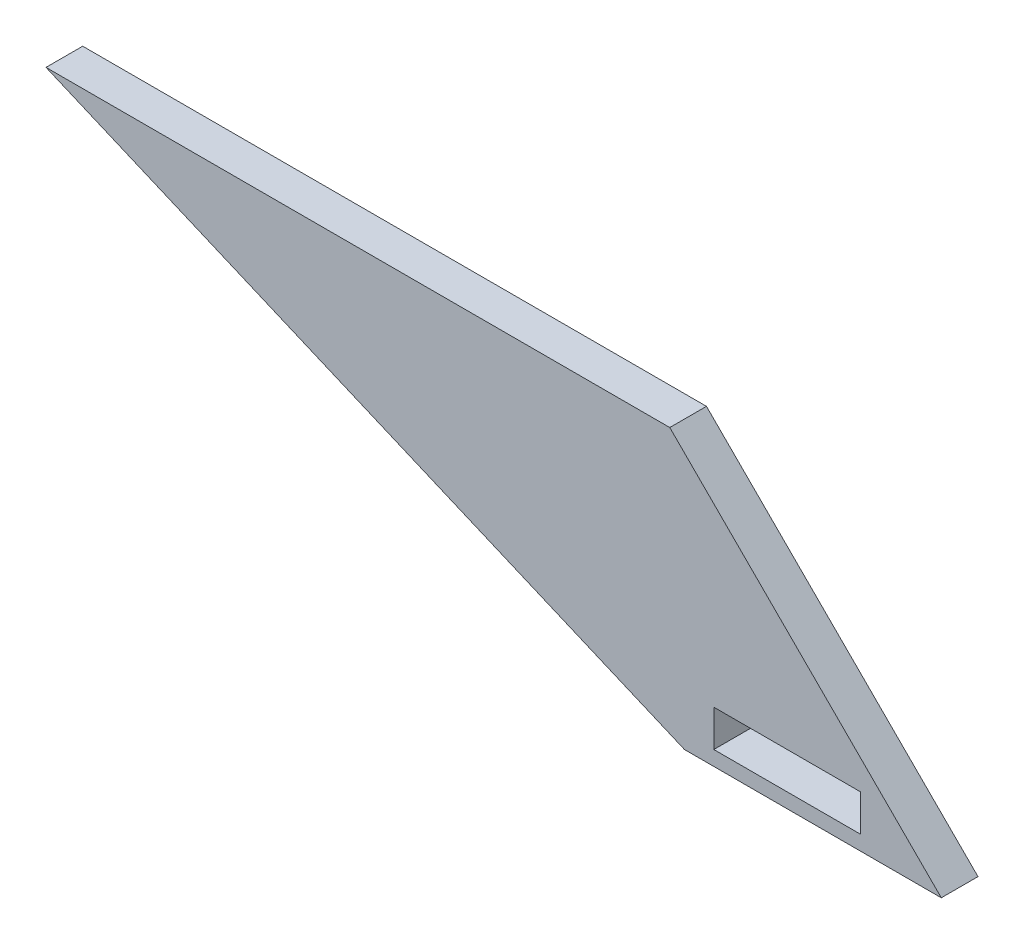
ISO-10303-21;
HEADER;
FILE_DESCRIPTION(('STEP AP214'),'2;1');
FILE_NAME('part.step','',(''),(''),'','','');
FILE_SCHEMA(('AUTOMOTIVE_DESIGN { 1 0 10303 214 1 1 1 1 }'));
ENDSEC;
DATA;
#1=APPLICATION_CONTEXT('core data for automotive mechanical design processes');
#2=APPLICATION_PROTOCOL_DEFINITION('international standard','automotive_design',2000,#1);
#3=PRODUCT_CONTEXT('',#1,'mechanical');
#4=PRODUCT('Part','Part','',(#3));
#5=PRODUCT_RELATED_PRODUCT_CATEGORY('part','',(#4));
#6=PRODUCT_DEFINITION_FORMATION('','',#4);
#7=PRODUCT_DEFINITION_CONTEXT('part definition',#1,'design');
#8=PRODUCT_DEFINITION('design','',#6,#7);
#9=PRODUCT_DEFINITION_SHAPE('','',#8);
#10=(LENGTH_UNIT() NAMED_UNIT(*) SI_UNIT(.MILLI.,.METRE.));
#11=(NAMED_UNIT(*) PLANE_ANGLE_UNIT() SI_UNIT($,.RADIAN.));
#12=(NAMED_UNIT(*) SI_UNIT($,.STERADIAN.) SOLID_ANGLE_UNIT());
#13=UNCERTAINTY_MEASURE_WITH_UNIT(LENGTH_MEASURE(1.E-05),#10,'distance_accuracy_value','');
#14=(GEOMETRIC_REPRESENTATION_CONTEXT(3) GLOBAL_UNCERTAINTY_ASSIGNED_CONTEXT((#13)) GLOBAL_UNIT_ASSIGNED_CONTEXT((#10,
#11,#12)) REPRESENTATION_CONTEXT('',''));
#15=CARTESIAN_POINT('',(0.,0.,0.));
#16=DIRECTION('',(0.,0.,1.));
#17=DIRECTION('',(1.,0.,0.));
#18=AXIS2_PLACEMENT_3D('',#15,#16,#17);
#19=CARTESIAN_POINT('',(14.9175348755076,6.59668020483856,5.));
#20=DIRECTION('',(0.391364608048821,0.920235700006685,0.));
#21=DIRECTION('',(-0.920235700006685,0.391364608048821,0.));
#22=AXIS2_PLACEMENT_3D('',#19,#20,#21);
#23=PLANE('',#22);
#24=DIRECTION('',(0.920235700006685,-0.391364608048821,0.));
#25=VECTOR('',#24,1.);
#26=CARTESIAN_POINT('',(14.9175348755076,6.59668020483856,0.));
#27=LINE('',#26,#25);
#28=CARTESIAN_POINT('',(-72.0824651244923,43.5966802048386,0.));
#29=VERTEX_POINT('',#28);
#30=CARTESIAN_POINT('',(14.9175348755076,6.59668020483856,0.));
#31=VERTEX_POINT('',#30);
#32=EDGE_CURVE('E122',#29,#31,#27,.T.);
#33=ORIENTED_EDGE('',*,*,#32,.T.);
#34=DIRECTION('',(0.,0.,-1.));
#35=VECTOR('',#34,1.);
#36=CARTESIAN_POINT('',(14.9175348755076,6.59668020483856,5.));
#37=LINE('',#36,#35);
#38=CARTESIAN_POINT('',(14.9175348755076,6.59668020483856,5.));
#39=VERTEX_POINT('',#38);
#40=EDGE_CURVE('E151',#39,#31,#37,.T.);
#41=ORIENTED_EDGE('',*,*,#40,.F.);
#42=DIRECTION('',(0.920235700006685,-0.391364608048821,0.));
#43=VECTOR('',#42,1.);
#44=CARTESIAN_POINT('',(14.9175348755076,6.59668020483856,5.));
#45=LINE('',#44,#43);
#46=CARTESIAN_POINT('',(-72.0824651244923,43.5966802048386,5.));
#47=VERTEX_POINT('',#46);
#48=EDGE_CURVE('E125',#47,#39,#45,.T.);
#49=ORIENTED_EDGE('',*,*,#48,.F.);
#50=DIRECTION('',(0.,0.,-1.));
#51=VECTOR('',#50,1.);
#52=CARTESIAN_POINT('',(-72.0824651244923,43.5966802048386,5.));
#53=LINE('',#52,#51);
#54=EDGE_CURVE('E135',#47,#29,#53,.T.);
#55=ORIENTED_EDGE('',*,*,#54,.T.);
#56=EDGE_LOOP('',(#33,#41,#49,#55));
#57=FACE_BOUND('',#56,.T.);
#58=ADVANCED_FACE('F33',(#57),#23,.F.);
#59=CARTESIAN_POINT('',(49.9175348755076,6.59668020483857,5.));
#60=DIRECTION('',(0.,1.,0.));
#61=DIRECTION('',(-1.,0.,0.));
#62=AXIS2_PLACEMENT_3D('',#59,#60,#61);
#63=PLANE('',#62);
#64=DIRECTION('',(1.,0.,0.));
#65=VECTOR('',#64,1.);
#66=CARTESIAN_POINT('',(49.9175348755076,6.59668020483857,0.));
#67=LINE('',#66,#65);
#68=CARTESIAN_POINT('',(49.9175348755076,6.59668020483857,0.));
#69=VERTEX_POINT('',#68);
#70=EDGE_CURVE('E138',#31,#69,#67,.T.);
#71=ORIENTED_EDGE('',*,*,#70,.T.);
#72=DIRECTION('',(0.,0.,-1.));
#73=VECTOR('',#72,1.);
#74=CARTESIAN_POINT('',(49.9175348755076,6.59668020483857,5.));
#75=LINE('',#74,#73);
#76=CARTESIAN_POINT('',(49.9175348755076,6.59668020483857,5.));
#77=VERTEX_POINT('',#76);
#78=EDGE_CURVE('E148',#77,#69,#75,.T.);
#79=ORIENTED_EDGE('',*,*,#78,.F.);
#80=DIRECTION('',(1.,0.,0.));
#81=VECTOR('',#80,1.);
#82=CARTESIAN_POINT('',(49.9175348755076,6.59668020483857,5.));
#83=LINE('',#82,#81);
#84=EDGE_CURVE('E128',#39,#77,#83,.T.);
#85=ORIENTED_EDGE('',*,*,#84,.F.);
#86=ORIENTED_EDGE('',*,*,#40,.T.);
#87=EDGE_LOOP('',(#71,#79,#85,#86));
#88=FACE_BOUND('',#87,.T.);
#89=ADVANCED_FACE('F176',(#88),#63,.F.);
#90=CARTESIAN_POINT('',(12.9175348755077,43.5966802048386,5.));
#91=DIRECTION('',(-0.707106781186549,-0.707106781186546,0.));
#92=DIRECTION('',(0.707106781186546,-0.707106781186549,0.));
#93=AXIS2_PLACEMENT_3D('',#90,#91,#92);
#94=PLANE('',#93);
#95=DIRECTION('',(-0.707106781186546,0.707106781186549,0.));
#96=VECTOR('',#95,1.);
#97=CARTESIAN_POINT('',(12.9175348755077,43.5966802048386,0.));
#98=LINE('',#97,#96);
#99=CARTESIAN_POINT('',(12.9175348755077,43.5966802048386,0.));
#100=VERTEX_POINT('',#99);
#101=EDGE_CURVE('E140',#69,#100,#98,.T.);
#102=ORIENTED_EDGE('',*,*,#101,.T.);
#103=DIRECTION('',(0.,0.,-1.));
#104=VECTOR('',#103,1.);
#105=CARTESIAN_POINT('',(12.9175348755077,43.5966802048386,5.));
#106=LINE('',#105,#104);
#107=CARTESIAN_POINT('',(12.9175348755077,43.5966802048386,5.));
#108=VERTEX_POINT('',#107);
#109=EDGE_CURVE('E145',#108,#100,#106,.T.);
#110=ORIENTED_EDGE('',*,*,#109,.F.);
#111=DIRECTION('',(-0.707106781186546,0.707106781186549,0.));
#112=VECTOR('',#111,1.);
#113=CARTESIAN_POINT('',(12.9175348755077,43.5966802048386,5.));
#114=LINE('',#113,#112);
#115=EDGE_CURVE('E131',#77,#108,#114,.T.);
#116=ORIENTED_EDGE('',*,*,#115,.F.);
#117=ORIENTED_EDGE('',*,*,#78,.T.);
#118=EDGE_LOOP('',(#102,#110,#116,#117));
#119=FACE_BOUND('',#118,.T.);
#120=ADVANCED_FACE('F181',(#119),#94,.F.);
#121=CARTESIAN_POINT('',(-72.0824651244923,43.5966802048386,5.));
#122=DIRECTION('',(0.,-1.,0.));
#123=DIRECTION('',(0.,0.,-1.));
#124=AXIS2_PLACEMENT_3D('',#121,#122,#123);
#125=PLANE('',#124);
#126=DIRECTION('',(-1.,0.,0.));
#127=VECTOR('',#126,1.);
#128=CARTESIAN_POINT('',(-72.0824651244923,43.5966802048386,0.));
#129=LINE('',#128,#127);
#130=EDGE_CURVE('E129',#100,#29,#129,.T.);
#131=ORIENTED_EDGE('',*,*,#130,.T.);
#132=ORIENTED_EDGE('',*,*,#54,.F.);
#133=DIRECTION('',(-1.,0.,0.));
#134=VECTOR('',#133,1.);
#135=CARTESIAN_POINT('',(-72.0824651244923,43.5966802048386,5.));
#136=LINE('',#135,#134);
#137=EDGE_CURVE('E133',#108,#47,#136,.T.);
#138=ORIENTED_EDGE('',*,*,#137,.F.);
#139=ORIENTED_EDGE('',*,*,#109,.T.);
#140=EDGE_LOOP('',(#131,#132,#138,#139));
#141=FACE_BOUND('',#140,.T.);
#142=ADVANCED_FACE('F194',(#141),#125,.F.);
#143=CARTESIAN_POINT('',(0.,0.,5.));
#144=DIRECTION('',(0.,0.,-1.));
#145=DIRECTION('',(-1.,0.,0.));
#146=AXIS2_PLACEMENT_3D('',#143,#144,#145);
#147=PLANE('',#146);
#148=DIRECTION('',(-1.,0.,0.));
#149=VECTOR('',#148,1.);
#150=CARTESIAN_POINT('',(18.9175348755076,13.5966802048386,5.));
#151=LINE('',#150,#149);
#152=CARTESIAN_POINT('',(38.9175348755076,13.5966802048386,5.));
#153=VERTEX_POINT('',#152);
#154=CARTESIAN_POINT('',(18.9175348755076,13.5966802048386,5.));
#155=VERTEX_POINT('',#154);
#156=EDGE_CURVE('E108',#153,#155,#151,.T.);
#157=ORIENTED_EDGE('',*,*,#156,.F.);
#158=DIRECTION('',(0.,1.,0.));
#159=VECTOR('',#158,1.);
#160=CARTESIAN_POINT('',(38.9175348755076,13.5966802048386,5.));
#161=LINE('',#160,#159);
#162=CARTESIAN_POINT('',(38.9175348755076,8.59668020483856,5.));
#163=VERTEX_POINT('',#162);
#164=EDGE_CURVE('E47',#163,#153,#161,.T.);
#165=ORIENTED_EDGE('',*,*,#164,.F.);
#166=DIRECTION('',(1.,0.,0.));
#167=VECTOR('',#166,1.);
#168=CARTESIAN_POINT('',(18.9175348755076,8.59668020483856,5.));
#169=LINE('',#168,#167);
#170=CARTESIAN_POINT('',(18.9175348755076,8.59668020483856,5.));
#171=VERTEX_POINT('',#170);
#172=EDGE_CURVE('E115',#171,#163,#169,.T.);
#173=ORIENTED_EDGE('',*,*,#172,.F.);
#174=DIRECTION('',(0.,-1.,0.));
#175=VECTOR('',#174,1.);
#176=CARTESIAN_POINT('',(18.9175348755076,13.5966802048386,5.));
#177=LINE('',#176,#175);
#178=EDGE_CURVE('E99',#155,#171,#177,.T.);
#179=ORIENTED_EDGE('',*,*,#178,.F.);
#180=EDGE_LOOP('',(#157,#165,#173,#179));
#181=FACE_BOUND('',#180,.T.);
#182=ORIENTED_EDGE('',*,*,#48,.T.);
#183=ORIENTED_EDGE('',*,*,#84,.T.);
#184=ORIENTED_EDGE('',*,*,#115,.T.);
#185=ORIENTED_EDGE('',*,*,#137,.T.);
#186=EDGE_LOOP('',(#182,#183,#184,#185));
#187=FACE_BOUND('',#186,.T.);
#188=ADVANCED_FACE('F112',(#181,#187),#147,.F.);
#189=CARTESIAN_POINT('',(0.,0.,0.));
#190=DIRECTION('',(0.,0.,-1.));
#191=DIRECTION('',(-1.,0.,0.));
#192=AXIS2_PLACEMENT_3D('',#189,#190,#191);
#193=PLANE('',#192);
#194=DIRECTION('',(0.,-1.,0.));
#195=VECTOR('',#194,1.);
#196=CARTESIAN_POINT('',(38.9175348755076,0.,0.));
#197=LINE('',#196,#195);
#198=CARTESIAN_POINT('',(38.9175348755076,13.5966802048386,0.));
#199=VERTEX_POINT('',#198);
#200=CARTESIAN_POINT('',(38.9175348755076,8.59668020483856,0.));
#201=VERTEX_POINT('',#200);
#202=EDGE_CURVE('E11',#199,#201,#197,.T.);
#203=ORIENTED_EDGE('',*,*,#202,.F.);
#204=DIRECTION('',(1.,0.,0.));
#205=VECTOR('',#204,1.);
#206=CARTESIAN_POINT('',(0.,13.5966802048386,0.));
#207=LINE('',#206,#205);
#208=CARTESIAN_POINT('',(18.9175348755076,13.5966802048386,0.));
#209=VERTEX_POINT('',#208);
#210=EDGE_CURVE('E154',#209,#199,#207,.T.);
#211=ORIENTED_EDGE('',*,*,#210,.F.);
#212=DIRECTION('',(0.,1.,0.));
#213=VECTOR('',#212,1.);
#214=CARTESIAN_POINT('',(18.9175348755076,0.,0.));
#215=LINE('',#214,#213);
#216=CARTESIAN_POINT('',(18.9175348755076,8.59668020483856,0.));
#217=VERTEX_POINT('',#216);
#218=EDGE_CURVE('E102',#217,#209,#215,.T.);
#219=ORIENTED_EDGE('',*,*,#218,.F.);
#220=DIRECTION('',(-1.,0.,0.));
#221=VECTOR('',#220,1.);
#222=CARTESIAN_POINT('',(0.,8.59668020483856,0.));
#223=LINE('',#222,#221);
#224=EDGE_CURVE('E40',#201,#217,#223,.T.);
#225=ORIENTED_EDGE('',*,*,#224,.F.);
#226=EDGE_LOOP('',(#203,#211,#219,#225));
#227=FACE_BOUND('',#226,.T.);
#228=ORIENTED_EDGE('',*,*,#32,.F.);
#229=ORIENTED_EDGE('',*,*,#130,.F.);
#230=ORIENTED_EDGE('',*,*,#101,.F.);
#231=ORIENTED_EDGE('',*,*,#70,.F.);
#232=EDGE_LOOP('',(#228,#229,#230,#231));
#233=FACE_BOUND('',#232,.T.);
#234=ADVANCED_FACE('F162',(#227,#233),#193,.T.);
#235=CARTESIAN_POINT('',(38.9175348755076,13.5966802048386,-5.));
#236=DIRECTION('',(1.,0.,0.));
#237=DIRECTION('',(0.,1.,0.));
#238=AXIS2_PLACEMENT_3D('',#235,#236,#237);
#239=PLANE('',#238);
#240=ORIENTED_EDGE('',*,*,#202,.T.);
#241=DIRECTION('',(0.,0.,1.));
#242=VECTOR('',#241,1.);
#243=CARTESIAN_POINT('',(38.9175348755076,8.59668020483856,-5.));
#244=LINE('',#243,#242);
#245=EDGE_CURVE('E120',#201,#163,#244,.T.);
#246=ORIENTED_EDGE('',*,*,#245,.T.);
#247=ORIENTED_EDGE('',*,*,#164,.T.);
#248=DIRECTION('',(0.,0.,1.));
#249=VECTOR('',#248,1.);
#250=CARTESIAN_POINT('',(38.9175348755076,13.5966802048386,-5.));
#251=LINE('',#250,#249);
#252=EDGE_CURVE('E105',#199,#153,#251,.T.);
#253=ORIENTED_EDGE('',*,*,#252,.F.);
#254=EDGE_LOOP('',(#240,#246,#247,#253));
#255=FACE_BOUND('',#254,.T.);
#256=ADVANCED_FACE('F164',(#255),#239,.F.);
#257=CARTESIAN_POINT('',(18.9175348755076,8.59668020483856,-5.));
#258=DIRECTION('',(0.,-1.,0.));
#259=DIRECTION('',(0.,0.,-1.));
#260=AXIS2_PLACEMENT_3D('',#257,#258,#259);
#261=PLANE('',#260);
#262=ORIENTED_EDGE('',*,*,#224,.T.);
#263=DIRECTION('',(0.,0.,1.));
#264=VECTOR('',#263,1.);
#265=CARTESIAN_POINT('',(18.9175348755076,8.59668020483856,-5.));
#266=LINE('',#265,#264);
#267=EDGE_CURVE('E104',#217,#171,#266,.T.);
#268=ORIENTED_EDGE('',*,*,#267,.T.);
#269=ORIENTED_EDGE('',*,*,#172,.T.);
#270=ORIENTED_EDGE('',*,*,#245,.F.);
#271=EDGE_LOOP('',(#262,#268,#269,#270));
#272=FACE_BOUND('',#271,.T.);
#273=ADVANCED_FACE('F159',(#272),#261,.F.);
#274=CARTESIAN_POINT('',(18.9175348755076,13.5966802048386,-5.));
#275=DIRECTION('',(-1.,0.,0.));
#276=DIRECTION('',(0.,0.,1.));
#277=AXIS2_PLACEMENT_3D('',#274,#275,#276);
#278=PLANE('',#277);
#279=ORIENTED_EDGE('',*,*,#218,.T.);
#280=DIRECTION('',(0.,0.,1.));
#281=VECTOR('',#280,1.);
#282=CARTESIAN_POINT('',(18.9175348755076,13.5966802048386,-5.));
#283=LINE('',#282,#281);
#284=EDGE_CURVE('E55',#209,#155,#283,.T.);
#285=ORIENTED_EDGE('',*,*,#284,.T.);
#286=ORIENTED_EDGE('',*,*,#178,.T.);
#287=ORIENTED_EDGE('',*,*,#267,.F.);
#288=EDGE_LOOP('',(#279,#285,#286,#287));
#289=FACE_BOUND('',#288,.T.);
#290=ADVANCED_FACE('F96',(#289),#278,.F.);
#291=CARTESIAN_POINT('',(18.9175348755076,13.5966802048386,-5.));
#292=DIRECTION('',(0.,1.,0.));
#293=DIRECTION('',(0.,0.,1.));
#294=AXIS2_PLACEMENT_3D('',#291,#292,#293);
#295=PLANE('',#294);
#296=ORIENTED_EDGE('',*,*,#210,.T.);
#297=ORIENTED_EDGE('',*,*,#252,.T.);
#298=ORIENTED_EDGE('',*,*,#156,.T.);
#299=ORIENTED_EDGE('',*,*,#284,.F.);
#300=EDGE_LOOP('',(#296,#297,#298,#299));
#301=FACE_BOUND('',#300,.T.);
#302=ADVANCED_FACE('F109',(#301),#295,.F.);
#303=CLOSED_SHELL('',(#58,#89,#120,#142,#188,#234,#256,#273,#290,#302));
#304=MANIFOLD_SOLID_BREP('B2',#303);
#305=ADVANCED_BREP_SHAPE_REPRESENTATION('',(#18,#304),#14);
#306=SHAPE_DEFINITION_REPRESENTATION(#9,#305);
ENDSEC;
END-ISO-10303-21;
